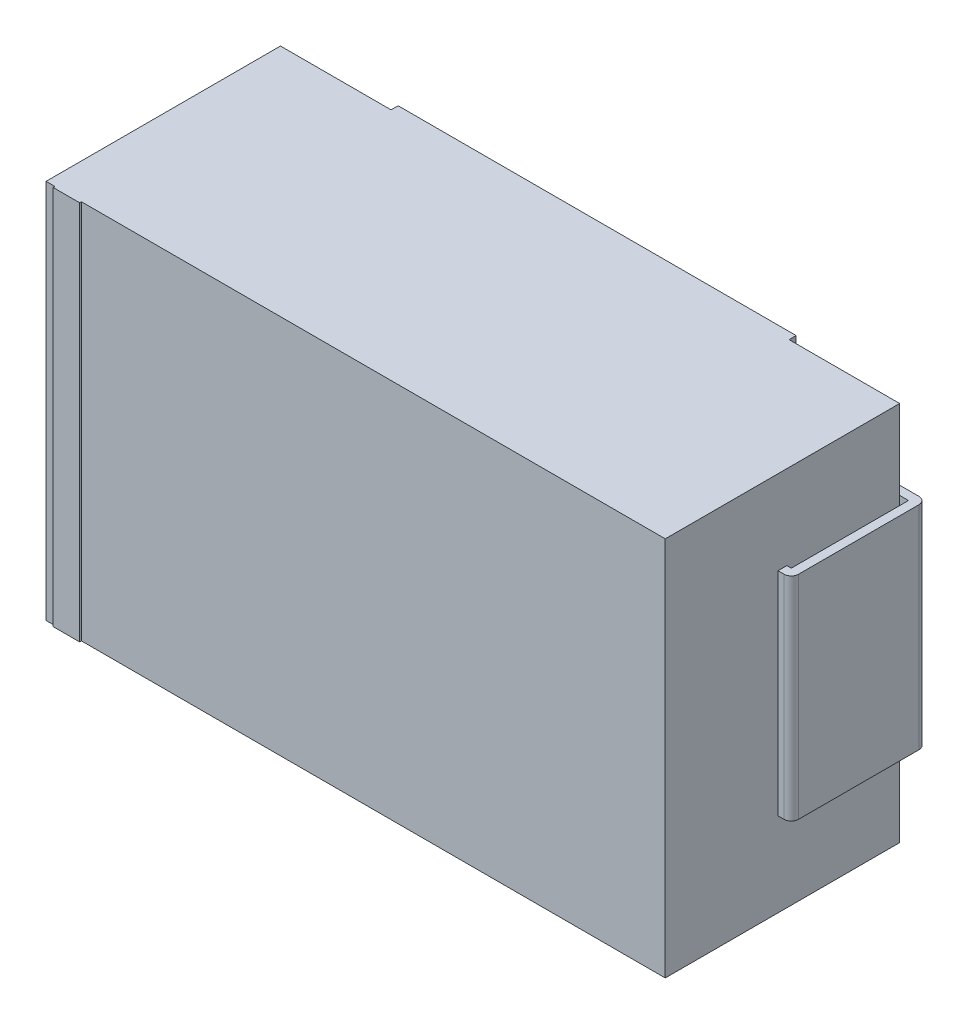
ISO-10303-21;
HEADER;
FILE_DESCRIPTION(('STEP AP214'),'2;1');
FILE_NAME('part.step','',(''),(''),'','','');
FILE_SCHEMA(('AUTOMOTIVE_DESIGN { 1 0 10303 214 1 1 1 1 }'));
ENDSEC;
DATA;
#1=APPLICATION_CONTEXT('core data for automotive mechanical design processes');
#2=APPLICATION_PROTOCOL_DEFINITION('international standard','automotive_design',2000,#1);
#3=PRODUCT_CONTEXT('',#1,'mechanical');
#4=PRODUCT('Part','Part','',(#3));
#5=PRODUCT_RELATED_PRODUCT_CATEGORY('part','',(#4));
#6=PRODUCT_DEFINITION_FORMATION('','',#4);
#7=PRODUCT_DEFINITION_CONTEXT('part definition',#1,'design');
#8=PRODUCT_DEFINITION('design','',#6,#7);
#9=PRODUCT_DEFINITION_SHAPE('','',#8);
#10=(LENGTH_UNIT() NAMED_UNIT(*) SI_UNIT(.MILLI.,.METRE.));
#11=(NAMED_UNIT(*) PLANE_ANGLE_UNIT() SI_UNIT($,.RADIAN.));
#12=(NAMED_UNIT(*) SI_UNIT($,.STERADIAN.) SOLID_ANGLE_UNIT());
#13=UNCERTAINTY_MEASURE_WITH_UNIT(LENGTH_MEASURE(1.E-05),#10,'distance_accuracy_value','');
#14=(GEOMETRIC_REPRESENTATION_CONTEXT(3) GLOBAL_UNCERTAINTY_ASSIGNED_CONTEXT((#13)) GLOBAL_UNIT_ASSIGNED_CONTEXT((#10,
#11,#12)) REPRESENTATION_CONTEXT('',''));
#15=CARTESIAN_POINT('',(0.,0.,0.));
#16=DIRECTION('',(0.,0.,1.));
#17=DIRECTION('',(1.,0.,0.));
#18=AXIS2_PLACEMENT_3D('',#15,#16,#17);
#19=CARTESIAN_POINT('',(6.475,2.15,2.8));
#20=DIRECTION('',(0.,0.,-1.));
#21=DIRECTION('',(-1.,0.,0.));
#22=AXIS2_PLACEMENT_3D('',#19,#20,#21);
#23=PLANE('',#22);
#24=DIRECTION('',(0.,-1.,0.));
#25=VECTOR('',#24,1.);
#26=CARTESIAN_POINT('',(-0.425,2.15,2.8));
#27=LINE('',#26,#25);
#28=CARTESIAN_POINT('',(-0.425,2.15,2.8));
#29=VERTEX_POINT('',#28);
#30=CARTESIAN_POINT('',(-0.425,-2.15,2.8));
#31=VERTEX_POINT('',#30);
#32=EDGE_CURVE('E267',#29,#31,#27,.T.);
#33=ORIENTED_EDGE('',*,*,#32,.F.);
#34=DIRECTION('',(-1.,0.,0.));
#35=VECTOR('',#34,1.);
#36=CARTESIAN_POINT('',(-0.525,2.15,2.8));
#37=LINE('',#36,#35);
#38=CARTESIAN_POINT('',(-0.525,2.15,2.8));
#39=VERTEX_POINT('',#38);
#40=EDGE_CURVE('E307',#29,#39,#37,.T.);
#41=ORIENTED_EDGE('',*,*,#40,.T.);
#42=DIRECTION('',(0.,-1.,0.));
#43=VECTOR('',#42,1.);
#44=CARTESIAN_POINT('',(-0.525,-2.15,2.8));
#45=LINE('',#44,#43);
#46=CARTESIAN_POINT('',(-0.525,-2.15,2.8));
#47=VERTEX_POINT('',#46);
#48=EDGE_CURVE('E313',#39,#47,#45,.T.);
#49=ORIENTED_EDGE('',*,*,#48,.T.);
#50=DIRECTION('',(1.,0.,0.));
#51=VECTOR('',#50,1.);
#52=CARTESIAN_POINT('',(-0.525,-2.15,2.8));
#53=LINE('',#52,#51);
#54=EDGE_CURVE('E59',#47,#31,#53,.T.);
#55=ORIENTED_EDGE('',*,*,#54,.T.);
#56=EDGE_LOOP('',(#33,#41,#49,#55));
#57=FACE_BOUND('',#56,.T.);
#58=ADVANCED_FACE('F34',(#57),#23,.F.);
#59=DIRECTION('',(0.,1.,0.));
#60=VECTOR('',#59,1.);
#61=CARTESIAN_POINT('',(-0.125,2.15,2.8));
#62=LINE('',#61,#60);
#63=CARTESIAN_POINT('',(-0.125,-2.15,2.8));
#64=VERTEX_POINT('',#63);
#65=CARTESIAN_POINT('',(-0.125,2.15,2.8));
#66=VERTEX_POINT('',#65);
#67=EDGE_CURVE('E51',#64,#66,#62,.T.);
#68=ORIENTED_EDGE('',*,*,#67,.F.);
#69=CARTESIAN_POINT('',(6.475,-2.15,2.8));
#70=VERTEX_POINT('',#69);
#71=EDGE_CURVE('E293',#64,#70,#53,.T.);
#72=ORIENTED_EDGE('',*,*,#71,.T.);
#73=DIRECTION('',(0.,1.,0.));
#74=VECTOR('',#73,1.);
#75=CARTESIAN_POINT('',(6.475,-2.15,2.8));
#76=LINE('',#75,#74);
#77=CARTESIAN_POINT('',(6.475,2.15,2.8));
#78=VERTEX_POINT('',#77);
#79=EDGE_CURVE('E311',#70,#78,#76,.T.);
#80=ORIENTED_EDGE('',*,*,#79,.T.);
#81=EDGE_CURVE('E310',#78,#66,#37,.T.);
#82=ORIENTED_EDGE('',*,*,#81,.T.);
#83=EDGE_LOOP('',(#68,#72,#80,#82));
#84=FACE_BOUND('',#83,.T.);
#85=ADVANCED_FACE('F531',(#84),#23,.F.);
#86=CARTESIAN_POINT('',(6.475,-2.15,2.8));
#87=DIRECTION('',(-1.,0.,0.));
#88=DIRECTION('',(0.,0.,1.));
#89=AXIS2_PLACEMENT_3D('',#86,#87,#88);
#90=PLANE('',#89);
#91=DIRECTION('',(0.,1.,0.));
#92=VECTOR('',#91,1.);
#93=CARTESIAN_POINT('',(6.475,-2.15,0.15));
#94=LINE('',#93,#92);
#95=CARTESIAN_POINT('',(6.475,-2.15,0.15));
#96=VERTEX_POINT('',#95);
#97=CARTESIAN_POINT('',(6.475,2.15,0.15));
#98=VERTEX_POINT('',#97);
#99=EDGE_CURVE('E326',#96,#98,#94,.T.);
#100=ORIENTED_EDGE('',*,*,#99,.T.);
#101=DIRECTION('',(0.,0.,-1.));
#102=VECTOR('',#101,1.);
#103=CARTESIAN_POINT('',(6.475,2.15,2.8));
#104=LINE('',#103,#102);
#105=EDGE_CURVE('E11',#78,#98,#104,.T.);
#106=ORIENTED_EDGE('',*,*,#105,.F.);
#107=ORIENTED_EDGE('',*,*,#79,.F.);
#108=DIRECTION('',(0.,0.,-1.));
#109=VECTOR('',#108,1.);
#110=CARTESIAN_POINT('',(6.475,-2.15,2.8));
#111=LINE('',#110,#109);
#112=EDGE_CURVE('E346',#70,#96,#111,.T.);
#113=ORIENTED_EDGE('',*,*,#112,.T.);
#114=EDGE_LOOP('',(#100,#106,#107,#113));
#115=FACE_BOUND('',#114,.T.);
#116=DIRECTION('',(0.,0.,1.));
#117=VECTOR('',#116,1.);
#118=CARTESIAN_POINT('',(6.475,1.2,1.425));
#119=LINE('',#118,#117);
#120=CARTESIAN_POINT('',(6.475,1.2,1.425));
#121=VERTEX_POINT('',#120);
#122=CARTESIAN_POINT('',(6.475,1.2,1.525));
#123=VERTEX_POINT('',#122);
#124=EDGE_CURVE('E562',#121,#123,#119,.T.);
#125=ORIENTED_EDGE('',*,*,#124,.F.);
#126=DIRECTION('',(0.,-1.,0.));
#127=VECTOR('',#126,1.);
#128=CARTESIAN_POINT('',(6.475,1.2,1.425));
#129=LINE('',#128,#127);
#130=CARTESIAN_POINT('',(6.475,-1.2,1.425));
#131=VERTEX_POINT('',#130);
#132=EDGE_CURVE('E564',#121,#131,#129,.T.);
#133=ORIENTED_EDGE('',*,*,#132,.T.);
#134=DIRECTION('',(0.,0.,1.));
#135=VECTOR('',#134,1.);
#136=CARTESIAN_POINT('',(6.475,-1.2,1.425));
#137=LINE('',#136,#135);
#138=CARTESIAN_POINT('',(6.475,-1.2,1.525));
#139=VERTEX_POINT('',#138);
#140=EDGE_CURVE('E594',#131,#139,#137,.T.);
#141=ORIENTED_EDGE('',*,*,#140,.T.);
#142=DIRECTION('',(0.,-1.,0.));
#143=VECTOR('',#142,1.);
#144=CARTESIAN_POINT('',(6.475,1.2,1.525));
#145=LINE('',#144,#143);
#146=EDGE_CURVE('E566',#123,#139,#145,.T.);
#147=ORIENTED_EDGE('',*,*,#146,.F.);
#148=EDGE_LOOP('',(#125,#133,#141,#147));
#149=FACE_BOUND('',#148,.T.);
#150=ADVANCED_FACE('F36',(#115,#149),#90,.F.);
#151=CARTESIAN_POINT('',(6.475,2.15,0.15));
#152=DIRECTION('',(0.,0.,-1.));
#153=DIRECTION('',(-1.,0.,0.));
#154=AXIS2_PLACEMENT_3D('',#151,#152,#153);
#155=PLANE('',#154);
#156=DIRECTION('',(0.,1.,0.));
#157=VECTOR('',#156,1.);
#158=CARTESIAN_POINT('',(0.725,-2.15,0.15));
#159=LINE('',#158,#157);
#160=CARTESIAN_POINT('',(0.725,-2.15,0.15));
#161=VERTEX_POINT('',#160);
#162=CARTESIAN_POINT('',(0.725,2.15,0.15));
#163=VERTEX_POINT('',#162);
#164=EDGE_CURVE('E362',#161,#163,#159,.T.);
#165=ORIENTED_EDGE('',*,*,#164,.F.);
#166=DIRECTION('',(1.,0.,0.));
#167=VECTOR('',#166,1.);
#168=CARTESIAN_POINT('',(-0.525,-2.15,0.15));
#169=LINE('',#168,#167);
#170=CARTESIAN_POINT('',(-0.525,-2.15,0.15));
#171=VERTEX_POINT('',#170);
#172=EDGE_CURVE('E316',#171,#161,#169,.T.);
#173=ORIENTED_EDGE('',*,*,#172,.F.);
#174=DIRECTION('',(0.,-1.,0.));
#175=VECTOR('',#174,1.);
#176=CARTESIAN_POINT('',(-0.525,-2.15,0.15));
#177=LINE('',#176,#175);
#178=CARTESIAN_POINT('',(-0.525,2.15,0.15));
#179=VERTEX_POINT('',#178);
#180=EDGE_CURVE('E334',#179,#171,#177,.T.);
#181=ORIENTED_EDGE('',*,*,#180,.F.);
#182=DIRECTION('',(-1.,0.,0.));
#183=VECTOR('',#182,1.);
#184=CARTESIAN_POINT('',(-0.525,2.15,0.15));
#185=LINE('',#184,#183);
#186=EDGE_CURVE('E330',#163,#179,#185,.T.);
#187=ORIENTED_EDGE('',*,*,#186,.F.);
#188=EDGE_LOOP('',(#165,#173,#181,#187));
#189=FACE_BOUND('',#188,.T.);
#190=ADVANCED_FACE('F359',(#189),#155,.T.);
#191=CARTESIAN_POINT('',(-0.525,2.15,2.8));
#192=DIRECTION('',(0.,-1.,0.));
#193=DIRECTION('',(0.,0.,-1.));
#194=AXIS2_PLACEMENT_3D('',#191,#192,#193);
#195=PLANE('',#194);
#196=CARTESIAN_POINT('',(5.225,2.15,0.15));
#197=VERTEX_POINT('',#196);
#198=EDGE_CURVE('E340',#98,#197,#185,.T.);
#199=ORIENTED_EDGE('',*,*,#198,.T.);
#200=DIRECTION('',(0.,0.,1.));
#201=VECTOR('',#200,1.);
#202=CARTESIAN_POINT('',(5.225,2.15,0.0699999999999997));
#203=LINE('',#202,#201);
#204=CARTESIAN_POINT('',(5.225,2.15,0.0699999999999997));
#205=VERTEX_POINT('',#204);
#206=EDGE_CURVE('E377',#205,#197,#203,.T.);
#207=ORIENTED_EDGE('',*,*,#206,.F.);
#208=DIRECTION('',(1.,0.,0.));
#209=VECTOR('',#208,1.);
#210=CARTESIAN_POINT('',(5.225,2.15,0.0699999999999997));
#211=LINE('',#210,#209);
#212=CARTESIAN_POINT('',(0.725,2.15,0.0699999999999997));
#213=VERTEX_POINT('',#212);
#214=EDGE_CURVE('E631',#213,#205,#211,.T.);
#215=ORIENTED_EDGE('',*,*,#214,.F.);
#216=DIRECTION('',(0.,0.,1.));
#217=VECTOR('',#216,1.);
#218=CARTESIAN_POINT('',(0.725,2.15,0.0699999999999997));
#219=LINE('',#218,#217);
#220=EDGE_CURVE('E402',#213,#163,#219,.T.);
#221=ORIENTED_EDGE('',*,*,#220,.T.);
#222=ORIENTED_EDGE('',*,*,#186,.T.);
#223=DIRECTION('',(0.,0.,-1.));
#224=VECTOR('',#223,1.);
#225=CARTESIAN_POINT('',(-0.525,2.15,2.8));
#226=LINE('',#225,#224);
#227=EDGE_CURVE('E43',#39,#179,#226,.T.);
#228=ORIENTED_EDGE('',*,*,#227,.F.);
#229=ORIENTED_EDGE('',*,*,#40,.F.);
#230=DIRECTION('',(0.,0.,-1.));
#231=VECTOR('',#230,1.);
#232=CARTESIAN_POINT('',(-0.425,2.15,2.82));
#233=LINE('',#232,#231);
#234=CARTESIAN_POINT('',(-0.425,2.15,2.82));
#235=VERTEX_POINT('',#234);
#236=EDGE_CURVE('E281',#235,#29,#233,.T.);
#237=ORIENTED_EDGE('',*,*,#236,.F.);
#238=DIRECTION('',(-1.,0.,0.));
#239=VECTOR('',#238,1.);
#240=CARTESIAN_POINT('',(-0.425,2.15,2.82));
#241=LINE('',#240,#239);
#242=CARTESIAN_POINT('',(-0.125,2.15,2.82));
#243=VERTEX_POINT('',#242);
#244=EDGE_CURVE('E261',#243,#235,#241,.T.);
#245=ORIENTED_EDGE('',*,*,#244,.F.);
#246=DIRECTION('',(0.,0.,-1.));
#247=VECTOR('',#246,1.);
#248=CARTESIAN_POINT('',(-0.125,2.15,2.82));
#249=LINE('',#248,#247);
#250=EDGE_CURVE('E273',#243,#66,#249,.T.);
#251=ORIENTED_EDGE('',*,*,#250,.T.);
#252=ORIENTED_EDGE('',*,*,#81,.F.);
#253=ORIENTED_EDGE('',*,*,#105,.T.);
#254=EDGE_LOOP('',(#199,#207,#215,#221,#222,#228,#229,#237,#245,#251,#252,#253));
#255=FACE_BOUND('',#254,.T.);
#256=ADVANCED_FACE('F304',(#255),#195,.F.);
#257=CARTESIAN_POINT('',(-0.525,-2.15,2.8));
#258=DIRECTION('',(1.,0.,0.));
#259=DIRECTION('',(0.,0.,-1.));
#260=AXIS2_PLACEMENT_3D('',#257,#258,#259);
#261=PLANE('',#260);
#262=DIRECTION('',(0.,-1.,0.));
#263=VECTOR('',#262,1.);
#264=CARTESIAN_POINT('',(-0.525,1.2,1.425));
#265=LINE('',#264,#263);
#266=CARTESIAN_POINT('',(-0.525,1.2,1.425));
#267=VERTEX_POINT('',#266);
#268=CARTESIAN_POINT('',(-0.525,-1.2,1.425));
#269=VERTEX_POINT('',#268);
#270=EDGE_CURVE('E445',#267,#269,#265,.T.);
#271=ORIENTED_EDGE('',*,*,#270,.F.);
#272=DIRECTION('',(0.,0.,1.));
#273=VECTOR('',#272,1.);
#274=CARTESIAN_POINT('',(-0.525,1.2,1.425));
#275=LINE('',#274,#273);
#276=CARTESIAN_POINT('',(-0.525,1.2,1.525));
#277=VERTEX_POINT('',#276);
#278=EDGE_CURVE('E485',#267,#277,#275,.T.);
#279=ORIENTED_EDGE('',*,*,#278,.T.);
#280=DIRECTION('',(0.,-1.,0.));
#281=VECTOR('',#280,1.);
#282=CARTESIAN_POINT('',(-0.525,1.2,1.525));
#283=LINE('',#282,#281);
#284=CARTESIAN_POINT('',(-0.525,-1.2,1.525));
#285=VERTEX_POINT('',#284);
#286=EDGE_CURVE('E448',#277,#285,#283,.T.);
#287=ORIENTED_EDGE('',*,*,#286,.T.);
#288=DIRECTION('',(0.,0.,1.));
#289=VECTOR('',#288,1.);
#290=CARTESIAN_POINT('',(-0.525,-1.2,1.425));
#291=LINE('',#290,#289);
#292=EDGE_CURVE('E433',#269,#285,#291,.T.);
#293=ORIENTED_EDGE('',*,*,#292,.F.);
#294=EDGE_LOOP('',(#271,#279,#287,#293));
#295=FACE_BOUND('',#294,.T.);
#296=ORIENTED_EDGE('',*,*,#180,.T.);
#297=DIRECTION('',(0.,0.,-1.));
#298=VECTOR('',#297,1.);
#299=CARTESIAN_POINT('',(-0.525,-2.15,2.8));
#300=LINE('',#299,#298);
#301=EDGE_CURVE('E350',#47,#171,#300,.T.);
#302=ORIENTED_EDGE('',*,*,#301,.F.);
#303=ORIENTED_EDGE('',*,*,#48,.F.);
#304=ORIENTED_EDGE('',*,*,#227,.T.);
#305=EDGE_LOOP('',(#296,#302,#303,#304));
#306=FACE_BOUND('',#305,.T.);
#307=ADVANCED_FACE('F355',(#295,#306),#261,.F.);
#308=CARTESIAN_POINT('',(-0.525,-2.15,2.8));
#309=DIRECTION('',(0.,1.,0.));
#310=DIRECTION('',(0.,0.,1.));
#311=AXIS2_PLACEMENT_3D('',#308,#309,#310);
#312=PLANE('',#311);
#313=ORIENTED_EDGE('',*,*,#172,.T.);
#314=DIRECTION('',(0.,0.,1.));
#315=VECTOR('',#314,1.);
#316=CARTESIAN_POINT('',(0.725,-2.15,0.0699999999999997));
#317=LINE('',#316,#315);
#318=CARTESIAN_POINT('',(0.725,-2.15,0.0699999999999997));
#319=VERTEX_POINT('',#318);
#320=EDGE_CURVE('E366',#319,#161,#317,.T.);
#321=ORIENTED_EDGE('',*,*,#320,.F.);
#322=DIRECTION('',(-1.,0.,0.));
#323=VECTOR('',#322,1.);
#324=CARTESIAN_POINT('',(5.225,-2.15,0.0699999999999997));
#325=LINE('',#324,#323);
#326=CARTESIAN_POINT('',(5.225,-2.15,0.0699999999999997));
#327=VERTEX_POINT('',#326);
#328=EDGE_CURVE('E374',#327,#319,#325,.T.);
#329=ORIENTED_EDGE('',*,*,#328,.F.);
#330=DIRECTION('',(0.,0.,1.));
#331=VECTOR('',#330,1.);
#332=CARTESIAN_POINT('',(5.225,-2.15,0.0699999999999997));
#333=LINE('',#332,#331);
#334=CARTESIAN_POINT('',(5.225,-2.15,0.15));
#335=VERTEX_POINT('',#334);
#336=EDGE_CURVE('E373',#327,#335,#333,.T.);
#337=ORIENTED_EDGE('',*,*,#336,.T.);
#338=EDGE_CURVE('E342',#335,#96,#169,.T.);
#339=ORIENTED_EDGE('',*,*,#338,.T.);
#340=ORIENTED_EDGE('',*,*,#112,.F.);
#341=ORIENTED_EDGE('',*,*,#71,.F.);
#342=DIRECTION('',(0.,0.,-1.));
#343=VECTOR('',#342,1.);
#344=CARTESIAN_POINT('',(-0.124999999999999,-2.15,2.82));
#345=LINE('',#344,#343);
#346=CARTESIAN_POINT('',(-0.124999999999999,-2.15,2.82));
#347=VERTEX_POINT('',#346);
#348=EDGE_CURVE('E252',#347,#64,#345,.T.);
#349=ORIENTED_EDGE('',*,*,#348,.F.);
#350=DIRECTION('',(1.,0.,0.));
#351=VECTOR('',#350,1.);
#352=CARTESIAN_POINT('',(-0.425,-2.15,2.82));
#353=LINE('',#352,#351);
#354=CARTESIAN_POINT('',(-0.425,-2.15,2.82));
#355=VERTEX_POINT('',#354);
#356=EDGE_CURVE('E244',#355,#347,#353,.T.);
#357=ORIENTED_EDGE('',*,*,#356,.F.);
#358=DIRECTION('',(0.,0.,-1.));
#359=VECTOR('',#358,1.);
#360=CARTESIAN_POINT('',(-0.425,-2.15,2.82));
#361=LINE('',#360,#359);
#362=EDGE_CURVE('E249',#355,#31,#361,.T.);
#363=ORIENTED_EDGE('',*,*,#362,.T.);
#364=ORIENTED_EDGE('',*,*,#54,.F.);
#365=ORIENTED_EDGE('',*,*,#301,.T.);
#366=EDGE_LOOP('',(#313,#321,#329,#337,#339,#340,#341,#349,#357,#363,#364,#365));
#367=FACE_BOUND('',#366,.T.);
#368=ADVANCED_FACE('F247',(#367),#312,.F.);
#369=DIRECTION('',(0.,-1.,0.));
#370=VECTOR('',#369,1.);
#371=CARTESIAN_POINT('',(5.225,-2.15,0.15));
#372=LINE('',#371,#370);
#373=EDGE_CURVE('E385',#197,#335,#372,.T.);
#374=ORIENTED_EDGE('',*,*,#373,.F.);
#375=ORIENTED_EDGE('',*,*,#198,.F.);
#376=ORIENTED_EDGE('',*,*,#99,.F.);
#377=ORIENTED_EDGE('',*,*,#338,.F.);
#378=EDGE_LOOP('',(#374,#375,#376,#377));
#379=FACE_BOUND('',#378,.T.);
#380=ADVANCED_FACE('F539',(#379),#155,.T.);
#381=CARTESIAN_POINT('',(-0.593137941361682,1.2,0.0999999999999999));
#382=DIRECTION('',(0.,0.,-1.));
#383=DIRECTION('',(-1.,0.,0.));
#384=AXIS2_PLACEMENT_3D('',#381,#382,#383);
#385=PLANE('',#384);
#386=DIRECTION('',(1.,0.,0.));
#387=VECTOR('',#386,1.);
#388=CARTESIAN_POINT('',(-0.593137941361682,-1.2,0.0999999999999999));
#389=LINE('',#388,#387);
#390=CARTESIAN_POINT('',(-0.575,-1.2,0.0999999999999999));
#391=VERTEX_POINT('',#390);
#392=CARTESIAN_POINT('',(0.625,-1.2,0.0999999999999999));
#393=VERTEX_POINT('',#392);
#394=EDGE_CURVE('E404',#391,#393,#389,.T.);
#395=ORIENTED_EDGE('',*,*,#394,.T.);
#396=DIRECTION('',(0.,-1.,0.));
#397=VECTOR('',#396,1.);
#398=CARTESIAN_POINT('',(0.625,1.2,0.0999999999999999));
#399=LINE('',#398,#397);
#400=CARTESIAN_POINT('',(0.625,1.2,0.0999999999999999));
#401=VERTEX_POINT('',#400);
#402=EDGE_CURVE('E331',#401,#393,#399,.T.);
#403=ORIENTED_EDGE('',*,*,#402,.F.);
#404=DIRECTION('',(1.,0.,0.));
#405=VECTOR('',#404,1.);
#406=CARTESIAN_POINT('',(-0.593137941361682,1.2,0.0999999999999999));
#407=LINE('',#406,#405);
#408=CARTESIAN_POINT('',(-0.575,1.2,0.0999999999999999));
#409=VERTEX_POINT('',#408);
#410=EDGE_CURVE('E394',#409,#401,#407,.T.);
#411=ORIENTED_EDGE('',*,*,#410,.F.);
#412=DIRECTION('',(0.,-1.,0.));
#413=VECTOR('',#412,1.);
#414=CARTESIAN_POINT('',(-0.575,1.2,0.0999999999999999));
#415=LINE('',#414,#413);
#416=EDGE_CURVE('E440',#409,#391,#415,.T.);
#417=ORIENTED_EDGE('',*,*,#416,.T.);
#418=EDGE_LOOP('',(#395,#403,#411,#417));
#419=FACE_BOUND('',#418,.T.);
#420=ADVANCED_FACE('F466',(#419),#385,.F.);
#421=CARTESIAN_POINT('',(0.625,1.2,0.));
#422=DIRECTION('',(1.,0.,0.));
#423=DIRECTION('',(0.,0.,-1.));
#424=AXIS2_PLACEMENT_3D('',#421,#422,#423);
#425=PLANE('',#424);
#426=DIRECTION('',(0.,0.,1.));
#427=VECTOR('',#426,1.);
#428=CARTESIAN_POINT('',(0.625,-1.2,0.));
#429=LINE('',#428,#427);
#430=CARTESIAN_POINT('',(0.625,-1.2,0.));
#431=VERTEX_POINT('',#430);
#432=EDGE_CURVE('E406',#431,#393,#429,.T.);
#433=ORIENTED_EDGE('',*,*,#432,.F.);
#434=DIRECTION('',(0.,-1.,0.));
#435=VECTOR('',#434,1.);
#436=CARTESIAN_POINT('',(0.625,1.2,0.));
#437=LINE('',#436,#435);
#438=CARTESIAN_POINT('',(0.625,1.2,0.));
#439=VERTEX_POINT('',#438);
#440=EDGE_CURVE('E458',#439,#431,#437,.T.);
#441=ORIENTED_EDGE('',*,*,#440,.F.);
#442=DIRECTION('',(0.,0.,1.));
#443=VECTOR('',#442,1.);
#444=CARTESIAN_POINT('',(0.625,1.2,0.));
#445=LINE('',#444,#443);
#446=EDGE_CURVE('E464',#439,#401,#445,.T.);
#447=ORIENTED_EDGE('',*,*,#446,.T.);
#448=ORIENTED_EDGE('',*,*,#402,.T.);
#449=EDGE_LOOP('',(#433,#441,#447,#448));
#450=FACE_BOUND('',#449,.T.);
#451=ADVANCED_FACE('F462',(#450),#425,.T.);
#452=CARTESIAN_POINT('',(-0.593137941361682,1.2,0.));
#453=DIRECTION('',(0.,0.,-1.));
#454=DIRECTION('',(-1.,0.,0.));
#455=AXIS2_PLACEMENT_3D('',#452,#453,#454);
#456=PLANE('',#455);
#457=DIRECTION('',(1.,0.,0.));
#458=VECTOR('',#457,1.);
#459=CARTESIAN_POINT('',(-0.593137941361682,-1.2,0.));
#460=LINE('',#459,#458);
#461=CARTESIAN_POINT('',(-0.593137941361682,-1.2,0.));
#462=VERTEX_POINT('',#461);
#463=EDGE_CURVE('E413',#462,#431,#460,.T.);
#464=ORIENTED_EDGE('',*,*,#463,.F.);
#465=DIRECTION('',(0.,-1.,0.));
#466=VECTOR('',#465,1.);
#467=CARTESIAN_POINT('',(-0.593137941361682,1.2,0.));
#468=LINE('',#467,#466);
#469=CARTESIAN_POINT('',(-0.593137941361682,1.2,0.));
#470=VERTEX_POINT('',#469);
#471=EDGE_CURVE('E456',#470,#462,#468,.T.);
#472=ORIENTED_EDGE('',*,*,#471,.F.);
#473=DIRECTION('',(1.,0.,0.));
#474=VECTOR('',#473,1.);
#475=CARTESIAN_POINT('',(-0.593137941361682,1.2,0.));
#476=LINE('',#475,#474);
#477=EDGE_CURVE('E469',#470,#439,#476,.T.);
#478=ORIENTED_EDGE('',*,*,#477,.T.);
#479=ORIENTED_EDGE('',*,*,#440,.T.);
#480=EDGE_LOOP('',(#464,#472,#478,#479));
#481=FACE_BOUND('',#480,.T.);
#482=ADVANCED_FACE('F501',(#481),#456,.T.);
#483=CARTESIAN_POINT('',(-0.593137941361682,1.2,0.0818620586383179));
#484=DIRECTION('',(0.,-1.,0.));
#485=DIRECTION('',(0.,0.,-1.));
#486=AXIS2_PLACEMENT_3D('',#483,#484,#485);
#487=CYLINDRICAL_SURFACE('',#486,0.0818620586383179);
#488=CARTESIAN_POINT('',(-0.593137941361682,-1.2,0.0818620586383179));
#489=DIRECTION('',(0.,1.,0.));
#490=DIRECTION('',(1.,0.,0.));
#491=AXIS2_PLACEMENT_3D('',#488,#489,#490);
#492=CIRCLE('',#491,0.0818620586383179);
#493=CARTESIAN_POINT('',(-0.675,-1.2,0.0818620586383179));
#494=VERTEX_POINT('',#493);
#495=EDGE_CURVE('E421',#494,#462,#492,.F.);
#496=ORIENTED_EDGE('',*,*,#495,.F.);
#497=DIRECTION('',(0.,-1.,0.));
#498=VECTOR('',#497,1.);
#499=CARTESIAN_POINT('',(-0.675,1.2,0.0818620586383179));
#500=LINE('',#499,#498);
#501=CARTESIAN_POINT('',(-0.675,1.2,0.0818620586383179));
#502=VERTEX_POINT('',#501);
#503=EDGE_CURVE('E454',#502,#494,#500,.T.);
#504=ORIENTED_EDGE('',*,*,#503,.F.);
#505=CARTESIAN_POINT('',(-0.593137941361682,1.2,0.0818620586383179));
#506=DIRECTION('',(0.,1.,0.));
#507=DIRECTION('',(1.,0.,0.));
#508=AXIS2_PLACEMENT_3D('',#505,#506,#507);
#509=CIRCLE('',#508,0.0818620586383179);
#510=EDGE_CURVE('E471',#502,#470,#509,.F.);
#511=ORIENTED_EDGE('',*,*,#510,.T.);
#512=ORIENTED_EDGE('',*,*,#471,.T.);
#513=EDGE_LOOP('',(#496,#504,#511,#512));
#514=FACE_BOUND('',#513,.T.);
#515=ADVANCED_FACE('F506',(#514),#487,.T.);
#516=CARTESIAN_POINT('',(-0.675,1.2,1.44313794136168));
#517=DIRECTION('',(-1.,0.,0.));
#518=DIRECTION('',(0.,0.,1.));
#519=AXIS2_PLACEMENT_3D('',#516,#517,#518);
#520=PLANE('',#519);
#521=DIRECTION('',(0.,0.,-1.));
#522=VECTOR('',#521,1.);
#523=CARTESIAN_POINT('',(-0.675,-1.2,1.44313794136168));
#524=LINE('',#523,#522);
#525=CARTESIAN_POINT('',(-0.675,-1.2,1.44313794136168));
#526=VERTEX_POINT('',#525);
#527=EDGE_CURVE('E424',#526,#494,#524,.T.);
#528=ORIENTED_EDGE('',*,*,#527,.F.);
#529=DIRECTION('',(0.,-1.,0.));
#530=VECTOR('',#529,1.);
#531=CARTESIAN_POINT('',(-0.675,1.2,1.44313794136168));
#532=LINE('',#531,#530);
#533=CARTESIAN_POINT('',(-0.675,1.2,1.44313794136168));
#534=VERTEX_POINT('',#533);
#535=EDGE_CURVE('E452',#534,#526,#532,.T.);
#536=ORIENTED_EDGE('',*,*,#535,.F.);
#537=DIRECTION('',(0.,0.,-1.));
#538=VECTOR('',#537,1.);
#539=CARTESIAN_POINT('',(-0.675,1.2,1.44313794136168));
#540=LINE('',#539,#538);
#541=EDGE_CURVE('E476',#534,#502,#540,.T.);
#542=ORIENTED_EDGE('',*,*,#541,.T.);
#543=ORIENTED_EDGE('',*,*,#503,.T.);
#544=EDGE_LOOP('',(#528,#536,#542,#543));
#545=FACE_BOUND('',#544,.T.);
#546=ADVANCED_FACE('F509',(#545),#520,.T.);
#547=CARTESIAN_POINT('',(-0.593137941361682,1.2,1.44313794136168));
#548=DIRECTION('',(0.,-1.,0.));
#549=DIRECTION('',(0.,0.,-1.));
#550=AXIS2_PLACEMENT_3D('',#547,#548,#549);
#551=CYLINDRICAL_SURFACE('',#550,0.081862058638318);
#552=CARTESIAN_POINT('',(-0.593137941361682,-1.2,1.44313794136168));
#553=DIRECTION('',(0.,1.,0.));
#554=DIRECTION('',(1.,0.,0.));
#555=AXIS2_PLACEMENT_3D('',#552,#553,#554);
#556=CIRCLE('',#555,0.081862058638318);
#557=CARTESIAN_POINT('',(-0.593137941361682,-1.2,1.525));
#558=VERTEX_POINT('',#557);
#559=EDGE_CURVE('E427',#558,#526,#556,.F.);
#560=ORIENTED_EDGE('',*,*,#559,.F.);
#561=DIRECTION('',(0.,-1.,0.));
#562=VECTOR('',#561,1.);
#563=CARTESIAN_POINT('',(-0.593137941361682,1.2,1.525));
#564=LINE('',#563,#562);
#565=CARTESIAN_POINT('',(-0.593137941361682,1.2,1.525));
#566=VERTEX_POINT('',#565);
#567=EDGE_CURVE('E450',#566,#558,#564,.T.);
#568=ORIENTED_EDGE('',*,*,#567,.F.);
#569=CARTESIAN_POINT('',(-0.593137941361682,1.2,1.44313794136168));
#570=DIRECTION('',(0.,1.,0.));
#571=DIRECTION('',(1.,0.,0.));
#572=AXIS2_PLACEMENT_3D('',#569,#570,#571);
#573=CIRCLE('',#572,0.081862058638318);
#574=EDGE_CURVE('E479',#566,#534,#573,.F.);
#575=ORIENTED_EDGE('',*,*,#574,.T.);
#576=ORIENTED_EDGE('',*,*,#535,.T.);
#577=EDGE_LOOP('',(#560,#568,#575,#576));
#578=FACE_BOUND('',#577,.T.);
#579=ADVANCED_FACE('F514',(#578),#551,.T.);
#580=CARTESIAN_POINT('',(-0.525,1.2,1.525));
#581=DIRECTION('',(0.,0.,1.));
#582=DIRECTION('',(1.,0.,0.));
#583=AXIS2_PLACEMENT_3D('',#580,#581,#582);
#584=PLANE('',#583);
#585=DIRECTION('',(-1.,0.,0.));
#586=VECTOR('',#585,1.);
#587=CARTESIAN_POINT('',(-0.525,-1.2,1.525));
#588=LINE('',#587,#586);
#589=EDGE_CURVE('E430',#285,#558,#588,.T.);
#590=ORIENTED_EDGE('',*,*,#589,.F.);
#591=ORIENTED_EDGE('',*,*,#286,.F.);
#592=DIRECTION('',(-1.,0.,0.));
#593=VECTOR('',#592,1.);
#594=CARTESIAN_POINT('',(-0.525,1.2,1.525));
#595=LINE('',#594,#593);
#596=EDGE_CURVE('E482',#277,#566,#595,.T.);
#597=ORIENTED_EDGE('',*,*,#596,.T.);
#598=ORIENTED_EDGE('',*,*,#567,.T.);
#599=EDGE_LOOP('',(#590,#591,#597,#598));
#600=FACE_BOUND('',#599,.T.);
#601=ADVANCED_FACE('F517',(#600),#584,.T.);
#602=CARTESIAN_POINT('',(-0.525,1.2,1.425));
#603=DIRECTION('',(0.,0.,1.));
#604=DIRECTION('',(1.,0.,0.));
#605=AXIS2_PLACEMENT_3D('',#602,#603,#604);
#606=PLANE('',#605);
#607=DIRECTION('',(-1.,0.,0.));
#608=VECTOR('',#607,1.);
#609=CARTESIAN_POINT('',(-0.525,-1.2,1.425));
#610=LINE('',#609,#608);
#611=CARTESIAN_POINT('',(-0.575,-1.2,1.425));
#612=VERTEX_POINT('',#611);
#613=EDGE_CURVE('E436',#269,#612,#610,.T.);
#614=ORIENTED_EDGE('',*,*,#613,.T.);
#615=DIRECTION('',(0.,-1.,0.));
#616=VECTOR('',#615,1.);
#617=CARTESIAN_POINT('',(-0.575,1.2,1.425));
#618=LINE('',#617,#616);
#619=CARTESIAN_POINT('',(-0.575,1.2,1.425));
#620=VERTEX_POINT('',#619);
#621=EDGE_CURVE('E442',#620,#612,#618,.T.);
#622=ORIENTED_EDGE('',*,*,#621,.F.);
#623=DIRECTION('',(-1.,0.,0.));
#624=VECTOR('',#623,1.);
#625=CARTESIAN_POINT('',(-0.525,1.2,1.425));
#626=LINE('',#625,#624);
#627=EDGE_CURVE('E486',#267,#620,#626,.T.);
#628=ORIENTED_EDGE('',*,*,#627,.F.);
#629=ORIENTED_EDGE('',*,*,#270,.T.);
#630=EDGE_LOOP('',(#614,#622,#628,#629));
#631=FACE_BOUND('',#630,.T.);
#632=ADVANCED_FACE('F521',(#631),#606,.F.);
#633=CARTESIAN_POINT('',(-0.575,1.2,1.44313794136168));
#634=DIRECTION('',(-1.,0.,0.));
#635=DIRECTION('',(0.,0.,1.));
#636=AXIS2_PLACEMENT_3D('',#633,#634,#635);
#637=PLANE('',#636);
#638=DIRECTION('',(0.,0.,-1.));
#639=VECTOR('',#638,1.);
#640=CARTESIAN_POINT('',(-0.575,-1.2,1.44313794136168));
#641=LINE('',#640,#639);
#642=EDGE_CURVE('E438',#612,#391,#641,.T.);
#643=ORIENTED_EDGE('',*,*,#642,.T.);
#644=ORIENTED_EDGE('',*,*,#416,.F.);
#645=DIRECTION('',(0.,0.,-1.));
#646=VECTOR('',#645,1.);
#647=CARTESIAN_POINT('',(-0.575,1.2,1.44313794136168));
#648=LINE('',#647,#646);
#649=EDGE_CURVE('E416',#620,#409,#648,.T.);
#650=ORIENTED_EDGE('',*,*,#649,.F.);
#651=ORIENTED_EDGE('',*,*,#621,.T.);
#652=EDGE_LOOP('',(#643,#644,#650,#651));
#653=FACE_BOUND('',#652,.T.);
#654=ADVANCED_FACE('F493',(#653),#637,.F.);
#655=CARTESIAN_POINT('',(-0.593137941361682,1.2,0.0818620586383179));
#656=DIRECTION('',(0.,1.,0.));
#657=DIRECTION('',(0.,0.,1.));
#658=AXIS2_PLACEMENT_3D('',#655,#656,#657);
#659=PLANE('',#658);
#660=ORIENTED_EDGE('',*,*,#410,.T.);
#661=ORIENTED_EDGE('',*,*,#446,.F.);
#662=ORIENTED_EDGE('',*,*,#477,.F.);
#663=ORIENTED_EDGE('',*,*,#510,.F.);
#664=ORIENTED_EDGE('',*,*,#541,.F.);
#665=ORIENTED_EDGE('',*,*,#574,.F.);
#666=ORIENTED_EDGE('',*,*,#596,.F.);
#667=ORIENTED_EDGE('',*,*,#278,.F.);
#668=ORIENTED_EDGE('',*,*,#627,.T.);
#669=ORIENTED_EDGE('',*,*,#649,.T.);
#670=EDGE_LOOP('',(#660,#661,#662,#663,#664,#665,#666,#667,#668,#669));
#671=FACE_BOUND('',#670,.T.);
#672=ADVANCED_FACE('F491',(#671),#659,.T.);
#673=CARTESIAN_POINT('',(-0.593137941361682,-1.2,0.0818620586383179));
#674=DIRECTION('',(0.,1.,0.));
#675=DIRECTION('',(0.,0.,1.));
#676=AXIS2_PLACEMENT_3D('',#673,#674,#675);
#677=PLANE('',#676);
#678=ORIENTED_EDGE('',*,*,#394,.F.);
#679=ORIENTED_EDGE('',*,*,#642,.F.);
#680=ORIENTED_EDGE('',*,*,#613,.F.);
#681=ORIENTED_EDGE('',*,*,#292,.T.);
#682=ORIENTED_EDGE('',*,*,#589,.T.);
#683=ORIENTED_EDGE('',*,*,#559,.T.);
#684=ORIENTED_EDGE('',*,*,#527,.T.);
#685=ORIENTED_EDGE('',*,*,#495,.T.);
#686=ORIENTED_EDGE('',*,*,#463,.T.);
#687=ORIENTED_EDGE('',*,*,#432,.T.);
#688=EDGE_LOOP('',(#678,#679,#680,#681,#682,#683,#684,#685,#686,#687));
#689=FACE_BOUND('',#688,.T.);
#690=ADVANCED_FACE('F497',(#689),#677,.F.);
#691=CARTESIAN_POINT('',(0.725,-2.15,0.0699999999999997));
#692=DIRECTION('',(1.,0.,0.));
#693=DIRECTION('',(0.,0.,-1.));
#694=AXIS2_PLACEMENT_3D('',#691,#692,#693);
#695=PLANE('',#694);
#696=ORIENTED_EDGE('',*,*,#164,.T.);
#697=ORIENTED_EDGE('',*,*,#220,.F.);
#698=DIRECTION('',(0.,1.,0.));
#699=VECTOR('',#698,1.);
#700=CARTESIAN_POINT('',(0.725,-2.15,0.0699999999999997));
#701=LINE('',#700,#699);
#702=EDGE_CURVE('E372',#319,#213,#701,.T.);
#703=ORIENTED_EDGE('',*,*,#702,.F.);
#704=ORIENTED_EDGE('',*,*,#320,.T.);
#705=EDGE_LOOP('',(#696,#697,#703,#704));
#706=FACE_BOUND('',#705,.T.);
#707=ADVANCED_FACE('F369',(#706),#695,.F.);
#708=CARTESIAN_POINT('',(5.225,-2.15,0.0699999999999997));
#709=DIRECTION('',(-1.,0.,0.));
#710=DIRECTION('',(0.,0.,1.));
#711=AXIS2_PLACEMENT_3D('',#708,#709,#710);
#712=PLANE('',#711);
#713=ORIENTED_EDGE('',*,*,#373,.T.);
#714=ORIENTED_EDGE('',*,*,#336,.F.);
#715=DIRECTION('',(0.,-1.,0.));
#716=VECTOR('',#715,1.);
#717=CARTESIAN_POINT('',(5.225,-2.15,0.0699999999999997));
#718=LINE('',#717,#716);
#719=EDGE_CURVE('E379',#205,#327,#718,.T.);
#720=ORIENTED_EDGE('',*,*,#719,.F.);
#721=ORIENTED_EDGE('',*,*,#206,.T.);
#722=EDGE_LOOP('',(#713,#714,#720,#721));
#723=FACE_BOUND('',#722,.T.);
#724=ADVANCED_FACE('F638',(#723),#712,.F.);
#725=CARTESIAN_POINT('',(0.725,2.15,0.0699999999999997));
#726=DIRECTION('',(0.,0.,1.));
#727=DIRECTION('',(1.,0.,0.));
#728=AXIS2_PLACEMENT_3D('',#725,#726,#727);
#729=PLANE('',#728);
#730=ORIENTED_EDGE('',*,*,#702,.T.);
#731=ORIENTED_EDGE('',*,*,#214,.T.);
#732=ORIENTED_EDGE('',*,*,#719,.T.);
#733=ORIENTED_EDGE('',*,*,#328,.T.);
#734=EDGE_LOOP('',(#730,#731,#732,#733));
#735=FACE_BOUND('',#734,.T.);
#736=ADVANCED_FACE('F635',(#735),#729,.F.);
#737=CARTESIAN_POINT('',(6.54313794136168,1.2,0.0999999999999999));
#738=DIRECTION('',(0.,0.,1.));
#739=DIRECTION('',(1.,0.,0.));
#740=AXIS2_PLACEMENT_3D('',#737,#738,#739);
#741=PLANE('',#740);
#742=DIRECTION('',(-1.,0.,0.));
#743=VECTOR('',#742,1.);
#744=CARTESIAN_POINT('',(6.54313794136168,-1.2,0.0999999999999999));
#745=LINE('',#744,#743);
#746=CARTESIAN_POINT('',(6.525,-1.2,0.0999999999999999));
#747=VERTEX_POINT('',#746);
#748=CARTESIAN_POINT('',(5.325,-1.2,0.0999999999999999));
#749=VERTEX_POINT('',#748);
#750=EDGE_CURVE('E268',#747,#749,#745,.T.);
#751=ORIENTED_EDGE('',*,*,#750,.F.);
#752=DIRECTION('',(0.,-1.,0.));
#753=VECTOR('',#752,1.);
#754=CARTESIAN_POINT('',(6.525,1.2,0.0999999999999999));
#755=LINE('',#754,#753);
#756=CARTESIAN_POINT('',(6.525,1.2,0.0999999999999999));
#757=VERTEX_POINT('',#756);
#758=EDGE_CURVE('E386',#757,#747,#755,.T.);
#759=ORIENTED_EDGE('',*,*,#758,.F.);
#760=DIRECTION('',(-1.,0.,0.));
#761=VECTOR('',#760,1.);
#762=CARTESIAN_POINT('',(6.54313794136168,1.2,0.0999999999999999));
#763=LINE('',#762,#761);
#764=CARTESIAN_POINT('',(5.325,1.2,0.0999999999999999));
#765=VERTEX_POINT('',#764);
#766=EDGE_CURVE('E288',#757,#765,#763,.T.);
#767=ORIENTED_EDGE('',*,*,#766,.T.);
#768=DIRECTION('',(0.,-1.,0.));
#769=VECTOR('',#768,1.);
#770=CARTESIAN_POINT('',(5.325,1.2,0.0999999999999999));
#771=LINE('',#770,#769);
#772=EDGE_CURVE('E587',#765,#749,#771,.T.);
#773=ORIENTED_EDGE('',*,*,#772,.T.);
#774=EDGE_LOOP('',(#751,#759,#767,#773));
#775=FACE_BOUND('',#774,.T.);
#776=ADVANCED_FACE('F647',(#775),#741,.T.);
#777=CARTESIAN_POINT('',(6.525,1.2,1.44313794136168));
#778=DIRECTION('',(-1.,0.,0.));
#779=DIRECTION('',(0.,0.,1.));
#780=AXIS2_PLACEMENT_3D('',#777,#778,#779);
#781=PLANE('',#780);
#782=DIRECTION('',(0.,0.,-1.));
#783=VECTOR('',#782,1.);
#784=CARTESIAN_POINT('',(6.525,-1.2,1.44313794136168));
#785=LINE('',#784,#783);
#786=CARTESIAN_POINT('',(6.525,-1.2,1.425));
#787=VERTEX_POINT('',#786);
#788=EDGE_CURVE('E271',#787,#747,#785,.T.);
#789=ORIENTED_EDGE('',*,*,#788,.F.);
#790=DIRECTION('',(0.,-1.,0.));
#791=VECTOR('',#790,1.);
#792=CARTESIAN_POINT('',(6.525,1.2,1.425));
#793=LINE('',#792,#791);
#794=CARTESIAN_POINT('',(6.525,1.2,1.425));
#795=VERTEX_POINT('',#794);
#796=EDGE_CURVE('E627',#795,#787,#793,.T.);
#797=ORIENTED_EDGE('',*,*,#796,.F.);
#798=DIRECTION('',(0.,0.,-1.));
#799=VECTOR('',#798,1.);
#800=CARTESIAN_POINT('',(6.525,1.2,1.44313794136168));
#801=LINE('',#800,#799);
#802=EDGE_CURVE('E576',#795,#757,#801,.T.);
#803=ORIENTED_EDGE('',*,*,#802,.T.);
#804=ORIENTED_EDGE('',*,*,#758,.T.);
#805=EDGE_LOOP('',(#789,#797,#803,#804));
#806=FACE_BOUND('',#805,.T.);
#807=ADVANCED_FACE('F684',(#806),#781,.T.);
#808=CARTESIAN_POINT('',(6.475,1.2,1.425));
#809=DIRECTION('',(0.,0.,-1.));
#810=DIRECTION('',(-1.,0.,0.));
#811=AXIS2_PLACEMENT_3D('',#808,#809,#810);
#812=PLANE('',#811);
#813=DIRECTION('',(1.,0.,0.));
#814=VECTOR('',#813,1.);
#815=CARTESIAN_POINT('',(6.475,-1.2,1.425));
#816=LINE('',#815,#814);
#817=EDGE_CURVE('E591',#131,#787,#816,.T.);
#818=ORIENTED_EDGE('',*,*,#817,.F.);
#819=ORIENTED_EDGE('',*,*,#132,.F.);
#820=DIRECTION('',(1.,0.,0.));
#821=VECTOR('',#820,1.);
#822=CARTESIAN_POINT('',(6.475,1.2,1.425));
#823=LINE('',#822,#821);
#824=EDGE_CURVE('E571',#121,#795,#823,.T.);
#825=ORIENTED_EDGE('',*,*,#824,.T.);
#826=ORIENTED_EDGE('',*,*,#796,.T.);
#827=EDGE_LOOP('',(#818,#819,#825,#826));
#828=FACE_BOUND('',#827,.T.);
#829=ADVANCED_FACE('F694',(#828),#812,.T.);
#830=CARTESIAN_POINT('',(6.475,1.2,1.525));
#831=DIRECTION('',(0.,0.,-1.));
#832=DIRECTION('',(-1.,0.,0.));
#833=AXIS2_PLACEMENT_3D('',#830,#831,#832);
#834=PLANE('',#833);
#835=DIRECTION('',(1.,0.,0.));
#836=VECTOR('',#835,1.);
#837=CARTESIAN_POINT('',(6.475,-1.2,1.525));
#838=LINE('',#837,#836);
#839=CARTESIAN_POINT('',(6.54313794136168,-1.2,1.525));
#840=VERTEX_POINT('',#839);
#841=EDGE_CURVE('E596',#139,#840,#838,.T.);
#842=ORIENTED_EDGE('',*,*,#841,.T.);
#843=DIRECTION('',(0.,-1.,0.));
#844=VECTOR('',#843,1.);
#845=CARTESIAN_POINT('',(6.54313794136168,1.2,1.525));
#846=LINE('',#845,#844);
#847=CARTESIAN_POINT('',(6.54313794136168,1.2,1.525));
#848=VERTEX_POINT('',#847);
#849=EDGE_CURVE('E622',#848,#840,#846,.T.);
#850=ORIENTED_EDGE('',*,*,#849,.F.);
#851=DIRECTION('',(1.,0.,0.));
#852=VECTOR('',#851,1.);
#853=CARTESIAN_POINT('',(6.475,1.2,1.525));
#854=LINE('',#853,#852);
#855=EDGE_CURVE('E570',#123,#848,#854,.T.);
#856=ORIENTED_EDGE('',*,*,#855,.F.);
#857=ORIENTED_EDGE('',*,*,#146,.T.);
#858=EDGE_LOOP('',(#842,#850,#856,#857));
#859=FACE_BOUND('',#858,.T.);
#860=ADVANCED_FACE('F705',(#859),#834,.F.);
#861=CARTESIAN_POINT('',(6.54313794136168,1.2,1.44313794136168));
#862=DIRECTION('',(0.,-1.,0.));
#863=DIRECTION('',(0.,0.,-1.));
#864=AXIS2_PLACEMENT_3D('',#861,#862,#863);
#865=CYLINDRICAL_SURFACE('',#864,0.081862058638318);
#866=CARTESIAN_POINT('',(6.54313794136168,-1.2,1.44313794136168));
#867=DIRECTION('',(0.,-1.,0.));
#868=DIRECTION('',(-1.,0.,0.));
#869=AXIS2_PLACEMENT_3D('',#866,#867,#868);
#870=CIRCLE('',#869,0.081862058638318);
#871=CARTESIAN_POINT('',(6.625,-1.2,1.44313794136168));
#872=VERTEX_POINT('',#871);
#873=EDGE_CURVE('E598',#840,#872,#870,.F.);
#874=ORIENTED_EDGE('',*,*,#873,.T.);
#875=DIRECTION('',(0.,-1.,0.));
#876=VECTOR('',#875,1.);
#877=CARTESIAN_POINT('',(6.625,1.2,1.44313794136168));
#878=LINE('',#877,#876);
#879=CARTESIAN_POINT('',(6.625,1.2,1.44313794136168));
#880=VERTEX_POINT('',#879);
#881=EDGE_CURVE('E619',#880,#872,#878,.T.);
#882=ORIENTED_EDGE('',*,*,#881,.F.);
#883=CARTESIAN_POINT('',(6.54313794136168,1.2,1.44313794136168));
#884=DIRECTION('',(0.,-1.,0.));
#885=DIRECTION('',(-1.,0.,0.));
#886=AXIS2_PLACEMENT_3D('',#883,#884,#885);
#887=CIRCLE('',#886,0.081862058638318);
#888=EDGE_CURVE('E573',#848,#880,#887,.F.);
#889=ORIENTED_EDGE('',*,*,#888,.F.);
#890=ORIENTED_EDGE('',*,*,#849,.T.);
#891=EDGE_LOOP('',(#874,#882,#889,#890));
#892=FACE_BOUND('',#891,.T.);
#893=ADVANCED_FACE('F715',(#892),#865,.T.);
#894=CARTESIAN_POINT('',(6.625,1.2,1.44313794136168));
#895=DIRECTION('',(-1.,0.,0.));
#896=DIRECTION('',(0.,0.,1.));
#897=AXIS2_PLACEMENT_3D('',#894,#895,#896);
#898=PLANE('',#897);
#899=DIRECTION('',(0.,0.,-1.));
#900=VECTOR('',#899,1.);
#901=CARTESIAN_POINT('',(6.625,-1.2,1.44313794136168));
#902=LINE('',#901,#900);
#903=CARTESIAN_POINT('',(6.625,-1.2,0.0818620586383179));
#904=VERTEX_POINT('',#903);
#905=EDGE_CURVE('E600',#872,#904,#902,.T.);
#906=ORIENTED_EDGE('',*,*,#905,.T.);
#907=DIRECTION('',(0.,-1.,0.));
#908=VECTOR('',#907,1.);
#909=CARTESIAN_POINT('',(6.625,1.2,0.0818620586383179));
#910=LINE('',#909,#908);
#911=CARTESIAN_POINT('',(6.625,1.2,0.0818620586383179));
#912=VERTEX_POINT('',#911);
#913=EDGE_CURVE('E616',#912,#904,#910,.T.);
#914=ORIENTED_EDGE('',*,*,#913,.F.);
#915=DIRECTION('',(0.,0.,-1.));
#916=VECTOR('',#915,1.);
#917=CARTESIAN_POINT('',(6.625,1.2,1.44313794136168));
#918=LINE('',#917,#916);
#919=EDGE_CURVE('E580',#880,#912,#918,.T.);
#920=ORIENTED_EDGE('',*,*,#919,.F.);
#921=ORIENTED_EDGE('',*,*,#881,.T.);
#922=EDGE_LOOP('',(#906,#914,#920,#921));
#923=FACE_BOUND('',#922,.T.);
#924=ADVANCED_FACE('F725',(#923),#898,.F.);
#925=CARTESIAN_POINT('',(6.54313794136168,1.2,0.0818620586383179));
#926=DIRECTION('',(0.,-1.,0.));
#927=DIRECTION('',(0.,0.,-1.));
#928=AXIS2_PLACEMENT_3D('',#925,#926,#927);
#929=CYLINDRICAL_SURFACE('',#928,0.0818620586383179);
#930=CARTESIAN_POINT('',(6.54313794136168,-1.2,0.0818620586383179));
#931=DIRECTION('',(0.,-1.,0.));
#932=DIRECTION('',(-1.,0.,0.));
#933=AXIS2_PLACEMENT_3D('',#930,#931,#932);
#934=CIRCLE('',#933,0.0818620586383179);
#935=CARTESIAN_POINT('',(6.54313794136168,-1.2,0.));
#936=VERTEX_POINT('',#935);
#937=EDGE_CURVE('E602',#904,#936,#934,.F.);
#938=ORIENTED_EDGE('',*,*,#937,.T.);
#939=DIRECTION('',(0.,-1.,0.));
#940=VECTOR('',#939,1.);
#941=CARTESIAN_POINT('',(6.54313794136168,1.2,0.));
#942=LINE('',#941,#940);
#943=CARTESIAN_POINT('',(6.54313794136168,1.2,0.));
#944=VERTEX_POINT('',#943);
#945=EDGE_CURVE('E613',#944,#936,#942,.T.);
#946=ORIENTED_EDGE('',*,*,#945,.F.);
#947=CARTESIAN_POINT('',(6.54313794136168,1.2,0.0818620586383179));
#948=DIRECTION('',(0.,-1.,0.));
#949=DIRECTION('',(-1.,0.,0.));
#950=AXIS2_PLACEMENT_3D('',#947,#948,#949);
#951=CIRCLE('',#950,0.0818620586383179);
#952=EDGE_CURVE('E582',#912,#944,#951,.F.);
#953=ORIENTED_EDGE('',*,*,#952,.F.);
#954=ORIENTED_EDGE('',*,*,#913,.T.);
#955=EDGE_LOOP('',(#938,#946,#953,#954));
#956=FACE_BOUND('',#955,.T.);
#957=ADVANCED_FACE('F735',(#956),#929,.T.);
#958=CARTESIAN_POINT('',(6.54313794136168,1.2,0.));
#959=DIRECTION('',(0.,0.,1.));
#960=DIRECTION('',(1.,0.,0.));
#961=AXIS2_PLACEMENT_3D('',#958,#959,#960);
#962=PLANE('',#961);
#963=DIRECTION('',(-1.,0.,0.));
#964=VECTOR('',#963,1.);
#965=CARTESIAN_POINT('',(6.54313794136168,-1.2,0.));
#966=LINE('',#965,#964);
#967=CARTESIAN_POINT('',(5.325,-1.2,0.));
#968=VERTEX_POINT('',#967);
#969=EDGE_CURVE('E604',#936,#968,#966,.T.);
#970=ORIENTED_EDGE('',*,*,#969,.T.);
#971=DIRECTION('',(0.,-1.,0.));
#972=VECTOR('',#971,1.);
#973=CARTESIAN_POINT('',(5.325,1.2,0.));
#974=LINE('',#973,#972);
#975=CARTESIAN_POINT('',(5.325,1.2,0.));
#976=VERTEX_POINT('',#975);
#977=EDGE_CURVE('E610',#976,#968,#974,.T.);
#978=ORIENTED_EDGE('',*,*,#977,.F.);
#979=DIRECTION('',(-1.,0.,0.));
#980=VECTOR('',#979,1.);
#981=CARTESIAN_POINT('',(6.54313794136168,1.2,0.));
#982=LINE('',#981,#980);
#983=EDGE_CURVE('E584',#944,#976,#982,.T.);
#984=ORIENTED_EDGE('',*,*,#983,.F.);
#985=ORIENTED_EDGE('',*,*,#945,.T.);
#986=EDGE_LOOP('',(#970,#978,#984,#985));
#987=FACE_BOUND('',#986,.T.);
#988=ADVANCED_FACE('F745',(#987),#962,.F.);
#989=CARTESIAN_POINT('',(5.325,1.2,0.));
#990=DIRECTION('',(1.,0.,0.));
#991=DIRECTION('',(0.,0.,-1.));
#992=AXIS2_PLACEMENT_3D('',#989,#990,#991);
#993=PLANE('',#992);
#994=DIRECTION('',(0.,0.,1.));
#995=VECTOR('',#994,1.);
#996=CARTESIAN_POINT('',(5.325,-1.2,0.));
#997=LINE('',#996,#995);
#998=EDGE_CURVE('E606',#968,#749,#997,.T.);
#999=ORIENTED_EDGE('',*,*,#998,.T.);
#1000=ORIENTED_EDGE('',*,*,#772,.F.);
#1001=DIRECTION('',(0.,0.,1.));
#1002=VECTOR('',#1001,1.);
#1003=CARTESIAN_POINT('',(5.325,1.2,0.));
#1004=LINE('',#1003,#1002);
#1005=EDGE_CURVE('E586',#976,#765,#1004,.T.);
#1006=ORIENTED_EDGE('',*,*,#1005,.F.);
#1007=ORIENTED_EDGE('',*,*,#977,.T.);
#1008=EDGE_LOOP('',(#999,#1000,#1006,#1007));
#1009=FACE_BOUND('',#1008,.T.);
#1010=ADVANCED_FACE('F755',(#1009),#993,.F.);
#1011=CARTESIAN_POINT('',(6.54313794136168,1.2,1.44313794136168));
#1012=DIRECTION('',(0.,-1.,0.));
#1013=DIRECTION('',(0.,0.,-1.));
#1014=AXIS2_PLACEMENT_3D('',#1011,#1012,#1013);
#1015=PLANE('',#1014);
#1016=ORIENTED_EDGE('',*,*,#766,.F.);
#1017=ORIENTED_EDGE('',*,*,#802,.F.);
#1018=ORIENTED_EDGE('',*,*,#824,.F.);
#1019=ORIENTED_EDGE('',*,*,#124,.T.);
#1020=ORIENTED_EDGE('',*,*,#855,.T.);
#1021=ORIENTED_EDGE('',*,*,#888,.T.);
#1022=ORIENTED_EDGE('',*,*,#919,.T.);
#1023=ORIENTED_EDGE('',*,*,#952,.T.);
#1024=ORIENTED_EDGE('',*,*,#983,.T.);
#1025=ORIENTED_EDGE('',*,*,#1005,.T.);
#1026=EDGE_LOOP('',(#1016,#1017,#1018,#1019,#1020,#1021,#1022,#1023,#1024,#1025));
#1027=FACE_BOUND('',#1026,.T.);
#1028=ADVANCED_FACE('F764',(#1027),#1015,.F.);
#1029=CARTESIAN_POINT('',(6.54313794136168,-1.2,1.44313794136168));
#1030=DIRECTION('',(0.,-1.,0.));
#1031=DIRECTION('',(0.,0.,-1.));
#1032=AXIS2_PLACEMENT_3D('',#1029,#1030,#1031);
#1033=PLANE('',#1032);
#1034=ORIENTED_EDGE('',*,*,#750,.T.);
#1035=ORIENTED_EDGE('',*,*,#998,.F.);
#1036=ORIENTED_EDGE('',*,*,#969,.F.);
#1037=ORIENTED_EDGE('',*,*,#937,.F.);
#1038=ORIENTED_EDGE('',*,*,#905,.F.);
#1039=ORIENTED_EDGE('',*,*,#873,.F.);
#1040=ORIENTED_EDGE('',*,*,#841,.F.);
#1041=ORIENTED_EDGE('',*,*,#140,.F.);
#1042=ORIENTED_EDGE('',*,*,#817,.T.);
#1043=ORIENTED_EDGE('',*,*,#788,.T.);
#1044=EDGE_LOOP('',(#1034,#1035,#1036,#1037,#1038,#1039,#1040,#1041,#1042,#1043));
#1045=FACE_BOUND('',#1044,.T.);
#1046=ADVANCED_FACE('F773',(#1045),#1033,.T.);
#1047=CARTESIAN_POINT('',(-0.425,2.15,2.82));
#1048=DIRECTION('',(1.,0.,0.));
#1049=DIRECTION('',(0.,0.,-1.));
#1050=AXIS2_PLACEMENT_3D('',#1047,#1048,#1049);
#1051=PLANE('',#1050);
#1052=ORIENTED_EDGE('',*,*,#32,.T.);
#1053=ORIENTED_EDGE('',*,*,#362,.F.);
#1054=DIRECTION('',(0.,-1.,0.));
#1055=VECTOR('',#1054,1.);
#1056=CARTESIAN_POINT('',(-0.425,2.15,2.82));
#1057=LINE('',#1056,#1055);
#1058=EDGE_CURVE('E256',#235,#355,#1057,.T.);
#1059=ORIENTED_EDGE('',*,*,#1058,.F.);
#1060=ORIENTED_EDGE('',*,*,#236,.T.);
#1061=EDGE_LOOP('',(#1052,#1053,#1059,#1060));
#1062=FACE_BOUND('',#1061,.T.);
#1063=ADVANCED_FACE('F266',(#1062),#1051,.F.);
#1064=CARTESIAN_POINT('',(-0.125,2.15,2.82));
#1065=DIRECTION('',(-1.,0.,0.));
#1066=DIRECTION('',(0.,-1.,0.));
#1067=AXIS2_PLACEMENT_3D('',#1064,#1065,#1066);
#1068=PLANE('',#1067);
#1069=ORIENTED_EDGE('',*,*,#67,.T.);
#1070=ORIENTED_EDGE('',*,*,#250,.F.);
#1071=DIRECTION('',(0.,1.,0.));
#1072=VECTOR('',#1071,1.);
#1073=CARTESIAN_POINT('',(-0.125,2.15,2.82));
#1074=LINE('',#1073,#1072);
#1075=EDGE_CURVE('E255',#347,#243,#1074,.T.);
#1076=ORIENTED_EDGE('',*,*,#1075,.F.);
#1077=ORIENTED_EDGE('',*,*,#348,.T.);
#1078=EDGE_LOOP('',(#1069,#1070,#1076,#1077));
#1079=FACE_BOUND('',#1078,.T.);
#1080=ADVANCED_FACE('F302',(#1079),#1068,.F.);
#1081=CARTESIAN_POINT('',(-0.425,-2.15,2.82));
#1082=DIRECTION('',(0.,0.,1.));
#1083=DIRECTION('',(1.,0.,0.));
#1084=AXIS2_PLACEMENT_3D('',#1081,#1082,#1083);
#1085=PLANE('',#1084);
#1086=ORIENTED_EDGE('',*,*,#1058,.T.);
#1087=ORIENTED_EDGE('',*,*,#356,.T.);
#1088=ORIENTED_EDGE('',*,*,#1075,.T.);
#1089=ORIENTED_EDGE('',*,*,#244,.T.);
#1090=EDGE_LOOP('',(#1086,#1087,#1088,#1089));
#1091=FACE_BOUND('',#1090,.T.);
#1092=ADVANCED_FACE('F259',(#1091),#1085,.T.);
#1093=CLOSED_SHELL('',(#58,#85,#150,#190,#256,#307,#368,#380,#420,#451,#482,#515,#546,#579,#601,
#632,#654,#672,#690,#707,#724,#736,#776,#807,#829,#860,#893,#924,#957,#988,#1010,#1028,#1046,
#1063,#1080,#1092));
#1094=MANIFOLD_SOLID_BREP('B2',#1093);
#1095=ADVANCED_BREP_SHAPE_REPRESENTATION('',(#18,#1094),#14);
#1096=SHAPE_DEFINITION_REPRESENTATION(#9,#1095);
ENDSEC;
END-ISO-10303-21;
